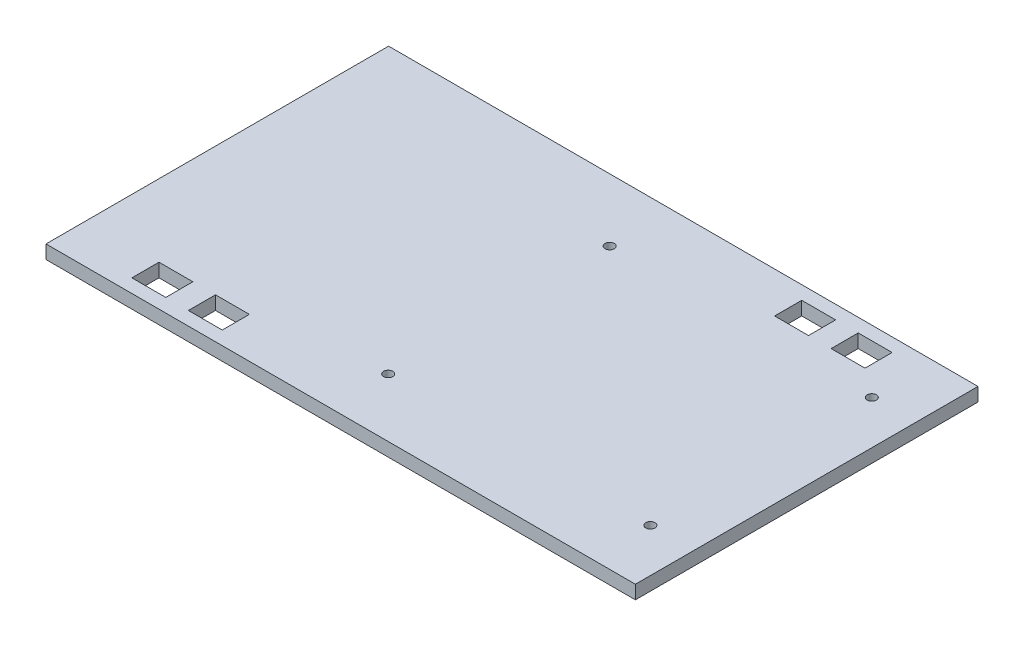
ISO-10303-21;
HEADER;
FILE_DESCRIPTION(('STEP AP214'),'2;1');
FILE_NAME('part.step','',(''),(''),'','','');
FILE_SCHEMA(('AUTOMOTIVE_DESIGN { 1 0 10303 214 1 1 1 1 }'));
ENDSEC;
DATA;
#1=APPLICATION_CONTEXT('core data for automotive mechanical design processes');
#2=APPLICATION_PROTOCOL_DEFINITION('international standard','automotive_design',2000,#1);
#3=PRODUCT_CONTEXT('',#1,'mechanical');
#4=PRODUCT('Part','Part','',(#3));
#5=PRODUCT_RELATED_PRODUCT_CATEGORY('part','',(#4));
#6=PRODUCT_DEFINITION_FORMATION('','',#4);
#7=PRODUCT_DEFINITION_CONTEXT('part definition',#1,'design');
#8=PRODUCT_DEFINITION('design','',#6,#7);
#9=PRODUCT_DEFINITION_SHAPE('','',#8);
#10=(LENGTH_UNIT() NAMED_UNIT(*) SI_UNIT(.MILLI.,.METRE.));
#11=(NAMED_UNIT(*) PLANE_ANGLE_UNIT() SI_UNIT($,.RADIAN.));
#12=(NAMED_UNIT(*) SI_UNIT($,.STERADIAN.) SOLID_ANGLE_UNIT());
#13=UNCERTAINTY_MEASURE_WITH_UNIT(LENGTH_MEASURE(1.E-05),#10,'distance_accuracy_value','');
#14=(GEOMETRIC_REPRESENTATION_CONTEXT(3) GLOBAL_UNCERTAINTY_ASSIGNED_CONTEXT((#13)) GLOBAL_UNIT_ASSIGNED_CONTEXT((#10,
#11,#12)) REPRESENTATION_CONTEXT('',''));
#15=CARTESIAN_POINT('',(0.,0.,0.));
#16=DIRECTION('',(0.,0.,1.));
#17=DIRECTION('',(1.,0.,0.));
#18=AXIS2_PLACEMENT_3D('',#15,#16,#17);
#19=CARTESIAN_POINT('',(0.,3.,75.8));
#20=DIRECTION('',(0.,0.,-1.));
#21=DIRECTION('',(-1.,0.,0.));
#22=AXIS2_PLACEMENT_3D('',#19,#20,#21);
#23=PLANE('',#22);
#24=DIRECTION('',(1.,0.,0.));
#25=VECTOR('',#24,1.);
#26=CARTESIAN_POINT('',(0.,0.,75.8));
#27=LINE('',#26,#25);
#28=CARTESIAN_POINT('',(0.,0.,75.8));
#29=VERTEX_POINT('',#28);
#30=CARTESIAN_POINT('',(130.41,0.,75.8));
#31=VERTEX_POINT('',#30);
#32=EDGE_CURVE('E312',#29,#31,#27,.T.);
#33=ORIENTED_EDGE('',*,*,#32,.T.);
#34=DIRECTION('',(0.,-1.,0.));
#35=VECTOR('',#34,1.);
#36=CARTESIAN_POINT('',(130.41,3.,75.8));
#37=LINE('',#36,#35);
#38=CARTESIAN_POINT('',(130.41,3.,75.8));
#39=VERTEX_POINT('',#38);
#40=EDGE_CURVE('E11',#39,#31,#37,.T.);
#41=ORIENTED_EDGE('',*,*,#40,.F.);
#42=DIRECTION('',(1.,0.,0.));
#43=VECTOR('',#42,1.);
#44=CARTESIAN_POINT('',(0.,3.,75.8));
#45=LINE('',#44,#43);
#46=CARTESIAN_POINT('',(0.,3.,75.8));
#47=VERTEX_POINT('',#46);
#48=EDGE_CURVE('E364',#47,#39,#45,.T.);
#49=ORIENTED_EDGE('',*,*,#48,.F.);
#50=DIRECTION('',(0.,-1.,0.));
#51=VECTOR('',#50,1.);
#52=CARTESIAN_POINT('',(0.,3.,75.8));
#53=LINE('',#52,#51);
#54=EDGE_CURVE('E379',#47,#29,#53,.T.);
#55=ORIENTED_EDGE('',*,*,#54,.T.);
#56=EDGE_LOOP('',(#33,#41,#49,#55));
#57=FACE_BOUND('',#56,.T.);
#58=ADVANCED_FACE('F41',(#57),#23,.F.);
#59=CARTESIAN_POINT('',(130.41,3.,0.));
#60=DIRECTION('',(1.,0.,0.));
#61=DIRECTION('',(0.,0.,-1.));
#62=AXIS2_PLACEMENT_3D('',#59,#60,#61);
#63=PLANE('',#62);
#64=DIRECTION('',(0.,0.,1.));
#65=VECTOR('',#64,1.);
#66=CARTESIAN_POINT('',(130.41,0.,0.));
#67=LINE('',#66,#65);
#68=CARTESIAN_POINT('',(130.41,0.,0.));
#69=VERTEX_POINT('',#68);
#70=EDGE_CURVE('E383',#69,#31,#67,.T.);
#71=ORIENTED_EDGE('',*,*,#70,.F.);
#72=DIRECTION('',(0.,-1.,0.));
#73=VECTOR('',#72,1.);
#74=CARTESIAN_POINT('',(130.41,3.,0.));
#75=LINE('',#74,#73);
#76=CARTESIAN_POINT('',(130.41,3.,0.));
#77=VERTEX_POINT('',#76);
#78=EDGE_CURVE('E49',#77,#69,#75,.T.);
#79=ORIENTED_EDGE('',*,*,#78,.F.);
#80=DIRECTION('',(0.,0.,1.));
#81=VECTOR('',#80,1.);
#82=CARTESIAN_POINT('',(130.41,3.,0.));
#83=LINE('',#82,#81);
#84=EDGE_CURVE('E367',#77,#39,#83,.T.);
#85=ORIENTED_EDGE('',*,*,#84,.T.);
#86=ORIENTED_EDGE('',*,*,#40,.T.);
#87=EDGE_LOOP('',(#71,#79,#85,#86));
#88=FACE_BOUND('',#87,.T.);
#89=ADVANCED_FACE('F406',(#88),#63,.T.);
#90=CARTESIAN_POINT('',(0.,3.,0.));
#91=DIRECTION('',(0.,0.,-1.));
#92=DIRECTION('',(-1.,0.,0.));
#93=AXIS2_PLACEMENT_3D('',#90,#91,#92);
#94=PLANE('',#93);
#95=DIRECTION('',(1.,0.,0.));
#96=VECTOR('',#95,1.);
#97=CARTESIAN_POINT('',(0.,0.,0.));
#98=LINE('',#97,#96);
#99=CARTESIAN_POINT('',(0.,0.,0.));
#100=VERTEX_POINT('',#99);
#101=EDGE_CURVE('E387',#100,#69,#98,.T.);
#102=ORIENTED_EDGE('',*,*,#101,.F.);
#103=DIRECTION('',(0.,-1.,0.));
#104=VECTOR('',#103,1.);
#105=CARTESIAN_POINT('',(0.,3.,0.));
#106=LINE('',#105,#104);
#107=CARTESIAN_POINT('',(0.,3.,0.));
#108=VERTEX_POINT('',#107);
#109=EDGE_CURVE('E396',#108,#100,#106,.T.);
#110=ORIENTED_EDGE('',*,*,#109,.F.);
#111=DIRECTION('',(1.,0.,0.));
#112=VECTOR('',#111,1.);
#113=CARTESIAN_POINT('',(0.,3.,0.));
#114=LINE('',#113,#112);
#115=EDGE_CURVE('E372',#108,#77,#114,.T.);
#116=ORIENTED_EDGE('',*,*,#115,.T.);
#117=ORIENTED_EDGE('',*,*,#78,.T.);
#118=EDGE_LOOP('',(#102,#110,#116,#117));
#119=FACE_BOUND('',#118,.T.);
#120=ADVANCED_FACE('F402',(#119),#94,.T.);
#121=CARTESIAN_POINT('',(0.,3.,0.));
#122=DIRECTION('',(1.,0.,0.));
#123=DIRECTION('',(0.,0.,-1.));
#124=AXIS2_PLACEMENT_3D('',#121,#122,#123);
#125=PLANE('',#124);
#126=DIRECTION('',(0.,0.,1.));
#127=VECTOR('',#126,1.);
#128=CARTESIAN_POINT('',(0.,0.,0.));
#129=LINE('',#128,#127);
#130=EDGE_CURVE('E368',#100,#29,#129,.T.);
#131=ORIENTED_EDGE('',*,*,#130,.T.);
#132=ORIENTED_EDGE('',*,*,#54,.F.);
#133=DIRECTION('',(0.,0.,1.));
#134=VECTOR('',#133,1.);
#135=CARTESIAN_POINT('',(0.,3.,0.));
#136=LINE('',#135,#134);
#137=EDGE_CURVE('E376',#108,#47,#136,.T.);
#138=ORIENTED_EDGE('',*,*,#137,.F.);
#139=ORIENTED_EDGE('',*,*,#109,.T.);
#140=EDGE_LOOP('',(#131,#132,#138,#139));
#141=FACE_BOUND('',#140,.T.);
#142=ADVANCED_FACE('F414',(#141),#125,.F.);
#143=CARTESIAN_POINT('',(0.,3.,0.));
#144=DIRECTION('',(0.,-1.,0.));
#145=DIRECTION('',(0.,0.,-1.));
#146=AXIS2_PLACEMENT_3D('',#143,#144,#145);
#147=PLANE('',#146);
#148=CARTESIAN_POINT('',(62.77,3.,13.86));
#149=DIRECTION('',(0.,-1.,0.));
#150=DIRECTION('',(0.,0.,-1.));
#151=AXIS2_PLACEMENT_3D('',#148,#149,#150);
#152=CIRCLE('',#151,1.025);
#153=CARTESIAN_POINT('',(62.77,3.,12.835));
#154=VERTEX_POINT('',#153);
#155=EDGE_CURVE('E655',#154,#154,#152,.T.);
#156=ORIENTED_EDGE('',*,*,#155,.T.);
#157=EDGE_LOOP('',(#156));
#158=FACE_BOUND('',#157,.T.);
#159=CARTESIAN_POINT('',(62.77,3.,62.86));
#160=DIRECTION('',(0.,-1.,0.));
#161=DIRECTION('',(0.,0.,-1.));
#162=AXIS2_PLACEMENT_3D('',#159,#160,#161);
#163=CIRCLE('',#162,1.025);
#164=CARTESIAN_POINT('',(62.77,3.,61.835));
#165=VERTEX_POINT('',#164);
#166=EDGE_CURVE('E660',#165,#165,#163,.T.);
#167=ORIENTED_EDGE('',*,*,#166,.T.);
#168=EDGE_LOOP('',(#167));
#169=FACE_BOUND('',#168,.T.);
#170=CARTESIAN_POINT('',(120.77,3.,13.86));
#171=DIRECTION('',(0.,-1.,0.));
#172=DIRECTION('',(0.,0.,-1.));
#173=AXIS2_PLACEMENT_3D('',#170,#171,#172);
#174=CIRCLE('',#173,1.025);
#175=CARTESIAN_POINT('',(120.77,3.,12.835));
#176=VERTEX_POINT('',#175);
#177=EDGE_CURVE('E254',#176,#176,#174,.T.);
#178=ORIENTED_EDGE('',*,*,#177,.T.);
#179=EDGE_LOOP('',(#178));
#180=FACE_BOUND('',#179,.T.);
#181=CARTESIAN_POINT('',(120.77,3.,62.86));
#182=DIRECTION('',(0.,-1.,0.));
#183=DIRECTION('',(0.,0.,-1.));
#184=AXIS2_PLACEMENT_3D('',#181,#182,#183);
#185=CIRCLE('',#184,1.025);
#186=CARTESIAN_POINT('',(120.77,3.,61.835));
#187=VERTEX_POINT('',#186);
#188=EDGE_CURVE('E678',#187,#187,#185,.T.);
#189=ORIENTED_EDGE('',*,*,#188,.T.);
#190=EDGE_LOOP('',(#189));
#191=FACE_BOUND('',#190,.T.);
#192=DIRECTION('',(-1.,0.,0.));
#193=VECTOR('',#192,1.);
#194=CARTESIAN_POINT('',(94.41,3.,9.));
#195=LINE('',#194,#193);
#196=CARTESIAN_POINT('',(101.91,3.,9.));
#197=VERTEX_POINT('',#196);
#198=CARTESIAN_POINT('',(94.41,3.,9.));
#199=VERTEX_POINT('',#198);
#200=EDGE_CURVE('E190',#197,#199,#195,.T.);
#201=ORIENTED_EDGE('',*,*,#200,.T.);
#202=DIRECTION('',(0.,0.,-1.));
#203=VECTOR('',#202,1.);
#204=CARTESIAN_POINT('',(94.41,3.,9.));
#205=LINE('',#204,#203);
#206=CARTESIAN_POINT('',(94.41,3.,3.));
#207=VERTEX_POINT('',#206);
#208=EDGE_CURVE('E181',#199,#207,#205,.T.);
#209=ORIENTED_EDGE('',*,*,#208,.T.);
#210=DIRECTION('',(1.,0.,0.));
#211=VECTOR('',#210,1.);
#212=CARTESIAN_POINT('',(94.41,3.,3.));
#213=LINE('',#212,#211);
#214=CARTESIAN_POINT('',(101.91,3.,3.));
#215=VERTEX_POINT('',#214);
#216=EDGE_CURVE('E193',#207,#215,#213,.T.);
#217=ORIENTED_EDGE('',*,*,#216,.T.);
#218=DIRECTION('',(0.,0.,1.));
#219=VECTOR('',#218,1.);
#220=CARTESIAN_POINT('',(101.91,3.,9.));
#221=LINE('',#220,#219);
#222=EDGE_CURVE('E56',#215,#197,#221,.T.);
#223=ORIENTED_EDGE('',*,*,#222,.T.);
#224=EDGE_LOOP('',(#201,#209,#217,#223));
#225=FACE_BOUND('',#224,.T.);
#226=DIRECTION('',(-1.,0.,0.));
#227=VECTOR('',#226,1.);
#228=CARTESIAN_POINT('',(106.91,3.,9.));
#229=LINE('',#228,#227);
#230=CARTESIAN_POINT('',(114.41,3.,9.));
#231=VERTEX_POINT('',#230);
#232=CARTESIAN_POINT('',(106.91,3.,9.));
#233=VERTEX_POINT('',#232);
#234=EDGE_CURVE('E245',#231,#233,#229,.T.);
#235=ORIENTED_EDGE('',*,*,#234,.T.);
#236=DIRECTION('',(0.,0.,-1.));
#237=VECTOR('',#236,1.);
#238=CARTESIAN_POINT('',(106.91,3.,9.));
#239=LINE('',#238,#237);
#240=CARTESIAN_POINT('',(106.91,3.,3.));
#241=VERTEX_POINT('',#240);
#242=EDGE_CURVE('E234',#233,#241,#239,.T.);
#243=ORIENTED_EDGE('',*,*,#242,.T.);
#244=DIRECTION('',(1.,0.,0.));
#245=VECTOR('',#244,1.);
#246=CARTESIAN_POINT('',(106.91,3.,3.));
#247=LINE('',#246,#245);
#248=CARTESIAN_POINT('',(114.41,3.,3.));
#249=VERTEX_POINT('',#248);
#250=EDGE_CURVE('E238',#241,#249,#247,.T.);
#251=ORIENTED_EDGE('',*,*,#250,.T.);
#252=DIRECTION('',(0.,0.,1.));
#253=VECTOR('',#252,1.);
#254=CARTESIAN_POINT('',(114.41,3.,9.));
#255=LINE('',#254,#253);
#256=EDGE_CURVE('E64',#249,#231,#255,.T.);
#257=ORIENTED_EDGE('',*,*,#256,.T.);
#258=EDGE_LOOP('',(#235,#243,#251,#257));
#259=FACE_BOUND('',#258,.T.);
#260=DIRECTION('',(-1.,0.,0.));
#261=VECTOR('',#260,1.);
#262=CARTESIAN_POINT('',(28.5,3.,72.8));
#263=LINE('',#262,#261);
#264=CARTESIAN_POINT('',(36.,3.,72.8));
#265=VERTEX_POINT('',#264);
#266=CARTESIAN_POINT('',(28.5,3.,72.8));
#267=VERTEX_POINT('',#266);
#268=EDGE_CURVE('E289',#265,#267,#263,.T.);
#269=ORIENTED_EDGE('',*,*,#268,.T.);
#270=DIRECTION('',(0.,0.,-1.));
#271=VECTOR('',#270,1.);
#272=CARTESIAN_POINT('',(28.5,3.,72.8));
#273=LINE('',#272,#271);
#274=CARTESIAN_POINT('',(28.5,3.,66.8));
#275=VERTEX_POINT('',#274);
#276=EDGE_CURVE('E276',#267,#275,#273,.T.);
#277=ORIENTED_EDGE('',*,*,#276,.T.);
#278=DIRECTION('',(1.,0.,0.));
#279=VECTOR('',#278,1.);
#280=CARTESIAN_POINT('',(28.5,3.,66.8));
#281=LINE('',#280,#279);
#282=CARTESIAN_POINT('',(36.,3.,66.8));
#283=VERTEX_POINT('',#282);
#284=EDGE_CURVE('E280',#275,#283,#281,.T.);
#285=ORIENTED_EDGE('',*,*,#284,.T.);
#286=DIRECTION('',(0.,0.,1.));
#287=VECTOR('',#286,1.);
#288=CARTESIAN_POINT('',(36.,3.,72.8));
#289=LINE('',#288,#287);
#290=EDGE_CURVE('E285',#283,#265,#289,.T.);
#291=ORIENTED_EDGE('',*,*,#290,.T.);
#292=EDGE_LOOP('',(#269,#277,#285,#291));
#293=FACE_BOUND('',#292,.T.);
#294=DIRECTION('',(-1.,0.,0.));
#295=VECTOR('',#294,1.);
#296=CARTESIAN_POINT('',(16.,3.,72.8));
#297=LINE('',#296,#295);
#298=CARTESIAN_POINT('',(23.5,3.,72.8));
#299=VERTEX_POINT('',#298);
#300=CARTESIAN_POINT('',(16.,3.,72.8));
#301=VERTEX_POINT('',#300);
#302=EDGE_CURVE('E335',#299,#301,#297,.T.);
#303=ORIENTED_EDGE('',*,*,#302,.T.);
#304=DIRECTION('',(0.,0.,-1.));
#305=VECTOR('',#304,1.);
#306=CARTESIAN_POINT('',(16.,3.,72.8));
#307=LINE('',#306,#305);
#308=CARTESIAN_POINT('',(16.,3.,66.8));
#309=VERTEX_POINT('',#308);
#310=EDGE_CURVE('E322',#301,#309,#307,.T.);
#311=ORIENTED_EDGE('',*,*,#310,.T.);
#312=DIRECTION('',(1.,0.,0.));
#313=VECTOR('',#312,1.);
#314=CARTESIAN_POINT('',(16.,3.,66.8));
#315=LINE('',#314,#313);
#316=CARTESIAN_POINT('',(23.5,3.,66.8));
#317=VERTEX_POINT('',#316);
#318=EDGE_CURVE('E326',#309,#317,#315,.T.);
#319=ORIENTED_EDGE('',*,*,#318,.T.);
#320=DIRECTION('',(0.,0.,1.));
#321=VECTOR('',#320,1.);
#322=CARTESIAN_POINT('',(23.5,3.,72.8));
#323=LINE('',#322,#321);
#324=EDGE_CURVE('E331',#317,#299,#323,.T.);
#325=ORIENTED_EDGE('',*,*,#324,.T.);
#326=EDGE_LOOP('',(#303,#311,#319,#325));
#327=FACE_BOUND('',#326,.T.);
#328=ORIENTED_EDGE('',*,*,#48,.T.);
#329=ORIENTED_EDGE('',*,*,#84,.F.);
#330=ORIENTED_EDGE('',*,*,#115,.F.);
#331=ORIENTED_EDGE('',*,*,#137,.T.);
#332=EDGE_LOOP('',(#328,#329,#330,#331));
#333=FACE_BOUND('',#332,.T.);
#334=ADVANCED_FACE('F198',(#158,#169,#180,#191,#225,#259,#293,#327,#333),#147,.F.);
#335=CARTESIAN_POINT('',(0.,0.,0.));
#336=DIRECTION('',(0.,-1.,0.));
#337=DIRECTION('',(0.,0.,-1.));
#338=AXIS2_PLACEMENT_3D('',#335,#336,#337);
#339=PLANE('',#338);
#340=CARTESIAN_POINT('',(62.77,0.,13.86));
#341=DIRECTION('',(0.,-1.,0.));
#342=DIRECTION('',(0.,0.,-1.));
#343=AXIS2_PLACEMENT_3D('',#340,#341,#342);
#344=CIRCLE('',#343,1.025);
#345=CARTESIAN_POINT('',(62.77,0.,12.835));
#346=VERTEX_POINT('',#345);
#347=EDGE_CURVE('E658',#346,#346,#344,.T.);
#348=ORIENTED_EDGE('',*,*,#347,.F.);
#349=EDGE_LOOP('',(#348));
#350=FACE_BOUND('',#349,.T.);
#351=CARTESIAN_POINT('',(62.77,0.,62.86));
#352=DIRECTION('',(0.,-1.,0.));
#353=DIRECTION('',(0.,0.,-1.));
#354=AXIS2_PLACEMENT_3D('',#351,#352,#353);
#355=CIRCLE('',#354,1.025);
#356=CARTESIAN_POINT('',(62.77,0.,61.835));
#357=VERTEX_POINT('',#356);
#358=EDGE_CURVE('E666',#357,#357,#355,.T.);
#359=ORIENTED_EDGE('',*,*,#358,.F.);
#360=EDGE_LOOP('',(#359));
#361=FACE_BOUND('',#360,.T.);
#362=CARTESIAN_POINT('',(120.77,0.,13.86));
#363=DIRECTION('',(0.,-1.,0.));
#364=DIRECTION('',(0.,0.,-1.));
#365=AXIS2_PLACEMENT_3D('',#362,#363,#364);
#366=CIRCLE('',#365,1.025);
#367=CARTESIAN_POINT('',(120.77,0.,12.835));
#368=VERTEX_POINT('',#367);
#369=EDGE_CURVE('E675',#368,#368,#366,.T.);
#370=ORIENTED_EDGE('',*,*,#369,.F.);
#371=EDGE_LOOP('',(#370));
#372=FACE_BOUND('',#371,.T.);
#373=CARTESIAN_POINT('',(120.77,0.,62.86));
#374=DIRECTION('',(0.,-1.,0.));
#375=DIRECTION('',(0.,0.,-1.));
#376=AXIS2_PLACEMENT_3D('',#373,#374,#375);
#377=CIRCLE('',#376,1.025);
#378=CARTESIAN_POINT('',(120.77,0.,61.835));
#379=VERTEX_POINT('',#378);
#380=EDGE_CURVE('E209',#379,#379,#377,.T.);
#381=ORIENTED_EDGE('',*,*,#380,.F.);
#382=EDGE_LOOP('',(#381));
#383=FACE_BOUND('',#382,.T.);
#384=DIRECTION('',(0.,0.,-1.));
#385=VECTOR('',#384,1.);
#386=CARTESIAN_POINT('',(94.41,0.,9.));
#387=LINE('',#386,#385);
#388=CARTESIAN_POINT('',(94.41,0.,9.));
#389=VERTEX_POINT('',#388);
#390=CARTESIAN_POINT('',(94.41,0.,3.));
#391=VERTEX_POINT('',#390);
#392=EDGE_CURVE('E184',#389,#391,#387,.T.);
#393=ORIENTED_EDGE('',*,*,#392,.F.);
#394=DIRECTION('',(-1.,0.,0.));
#395=VECTOR('',#394,1.);
#396=CARTESIAN_POINT('',(94.41,0.,9.));
#397=LINE('',#396,#395);
#398=CARTESIAN_POINT('',(101.91,0.,9.));
#399=VERTEX_POINT('',#398);
#400=EDGE_CURVE('E202',#399,#389,#397,.T.);
#401=ORIENTED_EDGE('',*,*,#400,.F.);
#402=DIRECTION('',(0.,0.,1.));
#403=VECTOR('',#402,1.);
#404=CARTESIAN_POINT('',(101.91,0.,9.));
#405=LINE('',#404,#403);
#406=CARTESIAN_POINT('',(101.91,0.,3.));
#407=VERTEX_POINT('',#406);
#408=EDGE_CURVE('E206',#407,#399,#405,.T.);
#409=ORIENTED_EDGE('',*,*,#408,.F.);
#410=DIRECTION('',(1.,0.,0.));
#411=VECTOR('',#410,1.);
#412=CARTESIAN_POINT('',(94.41,0.,3.));
#413=LINE('',#412,#411);
#414=EDGE_CURVE('E218',#391,#407,#413,.T.);
#415=ORIENTED_EDGE('',*,*,#414,.F.);
#416=EDGE_LOOP('',(#393,#401,#409,#415));
#417=FACE_BOUND('',#416,.T.);
#418=DIRECTION('',(0.,0.,-1.));
#419=VECTOR('',#418,1.);
#420=CARTESIAN_POINT('',(106.91,0.,9.));
#421=LINE('',#420,#419);
#422=CARTESIAN_POINT('',(106.91,0.,9.));
#423=VERTEX_POINT('',#422);
#424=CARTESIAN_POINT('',(106.91,0.,3.));
#425=VERTEX_POINT('',#424);
#426=EDGE_CURVE('E250',#423,#425,#421,.T.);
#427=ORIENTED_EDGE('',*,*,#426,.F.);
#428=DIRECTION('',(-1.,0.,0.));
#429=VECTOR('',#428,1.);
#430=CARTESIAN_POINT('',(106.91,0.,9.));
#431=LINE('',#430,#429);
#432=CARTESIAN_POINT('',(114.41,0.,9.));
#433=VERTEX_POINT('',#432);
#434=EDGE_CURVE('E239',#433,#423,#431,.T.);
#435=ORIENTED_EDGE('',*,*,#434,.F.);
#436=DIRECTION('',(0.,0.,1.));
#437=VECTOR('',#436,1.);
#438=CARTESIAN_POINT('',(114.41,0.,9.));
#439=LINE('',#438,#437);
#440=CARTESIAN_POINT('',(114.41,0.,3.));
#441=VERTEX_POINT('',#440);
#442=EDGE_CURVE('E258',#441,#433,#439,.T.);
#443=ORIENTED_EDGE('',*,*,#442,.F.);
#444=DIRECTION('',(1.,0.,0.));
#445=VECTOR('',#444,1.);
#446=CARTESIAN_POINT('',(106.91,0.,3.));
#447=LINE('',#446,#445);
#448=EDGE_CURVE('E253',#425,#441,#447,.T.);
#449=ORIENTED_EDGE('',*,*,#448,.F.);
#450=EDGE_LOOP('',(#427,#435,#443,#449));
#451=FACE_BOUND('',#450,.T.);
#452=DIRECTION('',(0.,0.,-1.));
#453=VECTOR('',#452,1.);
#454=CARTESIAN_POINT('',(28.5,0.,72.8));
#455=LINE('',#454,#453);
#456=CARTESIAN_POINT('',(28.5,0.,72.8));
#457=VERTEX_POINT('',#456);
#458=CARTESIAN_POINT('',(28.5,0.,66.8));
#459=VERTEX_POINT('',#458);
#460=EDGE_CURVE('E294',#457,#459,#455,.T.);
#461=ORIENTED_EDGE('',*,*,#460,.F.);
#462=DIRECTION('',(-1.,0.,0.));
#463=VECTOR('',#462,1.);
#464=CARTESIAN_POINT('',(28.5,0.,72.8));
#465=LINE('',#464,#463);
#466=CARTESIAN_POINT('',(36.,0.,72.8));
#467=VERTEX_POINT('',#466);
#468=EDGE_CURVE('E281',#467,#457,#465,.T.);
#469=ORIENTED_EDGE('',*,*,#468,.F.);
#470=DIRECTION('',(0.,0.,1.));
#471=VECTOR('',#470,1.);
#472=CARTESIAN_POINT('',(36.,0.,72.8));
#473=LINE('',#472,#471);
#474=CARTESIAN_POINT('',(36.,0.,66.8));
#475=VERTEX_POINT('',#474);
#476=EDGE_CURVE('E302',#475,#467,#473,.T.);
#477=ORIENTED_EDGE('',*,*,#476,.F.);
#478=DIRECTION('',(1.,0.,0.));
#479=VECTOR('',#478,1.);
#480=CARTESIAN_POINT('',(28.5,0.,66.8));
#481=LINE('',#480,#479);
#482=EDGE_CURVE('E297',#459,#475,#481,.T.);
#483=ORIENTED_EDGE('',*,*,#482,.F.);
#484=EDGE_LOOP('',(#461,#469,#477,#483));
#485=FACE_BOUND('',#484,.T.);
#486=DIRECTION('',(0.,0.,-1.));
#487=VECTOR('',#486,1.);
#488=CARTESIAN_POINT('',(16.,0.,72.8));
#489=LINE('',#488,#487);
#490=CARTESIAN_POINT('',(16.,0.,72.8));
#491=VERTEX_POINT('',#490);
#492=CARTESIAN_POINT('',(16.,0.,66.8));
#493=VERTEX_POINT('',#492);
#494=EDGE_CURVE('E228',#491,#493,#489,.T.);
#495=ORIENTED_EDGE('',*,*,#494,.F.);
#496=DIRECTION('',(-1.,0.,0.));
#497=VECTOR('',#496,1.);
#498=CARTESIAN_POINT('',(16.,0.,72.8));
#499=LINE('',#498,#497);
#500=CARTESIAN_POINT('',(23.5,0.,72.8));
#501=VERTEX_POINT('',#500);
#502=EDGE_CURVE('E327',#501,#491,#499,.T.);
#503=ORIENTED_EDGE('',*,*,#502,.F.);
#504=DIRECTION('',(0.,0.,1.));
#505=VECTOR('',#504,1.);
#506=CARTESIAN_POINT('',(23.5,0.,72.8));
#507=LINE('',#506,#505);
#508=CARTESIAN_POINT('',(23.5,0.,66.8));
#509=VERTEX_POINT('',#508);
#510=EDGE_CURVE('E346',#509,#501,#507,.T.);
#511=ORIENTED_EDGE('',*,*,#510,.F.);
#512=DIRECTION('',(1.,0.,0.));
#513=VECTOR('',#512,1.);
#514=CARTESIAN_POINT('',(16.,0.,66.8));
#515=LINE('',#514,#513);
#516=EDGE_CURVE('E342',#493,#509,#515,.T.);
#517=ORIENTED_EDGE('',*,*,#516,.F.);
#518=EDGE_LOOP('',(#495,#503,#511,#517));
#519=FACE_BOUND('',#518,.T.);
#520=ORIENTED_EDGE('',*,*,#32,.F.);
#521=ORIENTED_EDGE('',*,*,#130,.F.);
#522=ORIENTED_EDGE('',*,*,#101,.T.);
#523=ORIENTED_EDGE('',*,*,#70,.T.);
#524=EDGE_LOOP('',(#520,#521,#522,#523));
#525=FACE_BOUND('',#524,.T.);
#526=ADVANCED_FACE('F411',(#350,#361,#372,#383,#417,#451,#485,#519,#525),#339,.T.);
#527=CARTESIAN_POINT('',(16.,3.,72.8));
#528=DIRECTION('',(-1.,0.,0.));
#529=DIRECTION('',(0.,0.,1.));
#530=AXIS2_PLACEMENT_3D('',#527,#528,#529);
#531=PLANE('',#530);
#532=ORIENTED_EDGE('',*,*,#494,.T.);
#533=DIRECTION('',(0.,-1.,0.));
#534=VECTOR('',#533,1.);
#535=CARTESIAN_POINT('',(16.,3.,66.8));
#536=LINE('',#535,#534);
#537=EDGE_CURVE('E339',#309,#493,#536,.T.);
#538=ORIENTED_EDGE('',*,*,#537,.F.);
#539=ORIENTED_EDGE('',*,*,#310,.F.);
#540=DIRECTION('',(0.,-1.,0.));
#541=VECTOR('',#540,1.);
#542=CARTESIAN_POINT('',(16.,3.,72.8));
#543=LINE('',#542,#541);
#544=EDGE_CURVE('E298',#301,#491,#543,.T.);
#545=ORIENTED_EDGE('',*,*,#544,.T.);
#546=EDGE_LOOP('',(#532,#538,#539,#545));
#547=FACE_BOUND('',#546,.T.);
#548=ADVANCED_FACE('F426',(#547),#531,.F.);
#549=CARTESIAN_POINT('',(16.,3.,72.8));
#550=DIRECTION('',(0.,0.,1.));
#551=DIRECTION('',(1.,0.,0.));
#552=AXIS2_PLACEMENT_3D('',#549,#550,#551);
#553=PLANE('',#552);
#554=ORIENTED_EDGE('',*,*,#502,.T.);
#555=ORIENTED_EDGE('',*,*,#544,.F.);
#556=ORIENTED_EDGE('',*,*,#302,.F.);
#557=DIRECTION('',(0.,-1.,0.));
#558=VECTOR('',#557,1.);
#559=CARTESIAN_POINT('',(23.5,3.,72.8));
#560=LINE('',#559,#558);
#561=EDGE_CURVE('E355',#299,#501,#560,.T.);
#562=ORIENTED_EDGE('',*,*,#561,.T.);
#563=EDGE_LOOP('',(#554,#555,#556,#562));
#564=FACE_BOUND('',#563,.T.);
#565=ADVANCED_FACE('F457',(#564),#553,.F.);
#566=CARTESIAN_POINT('',(23.5,3.,72.8));
#567=DIRECTION('',(1.,0.,0.));
#568=DIRECTION('',(0.,0.,-1.));
#569=AXIS2_PLACEMENT_3D('',#566,#567,#568);
#570=PLANE('',#569);
#571=ORIENTED_EDGE('',*,*,#510,.T.);
#572=ORIENTED_EDGE('',*,*,#561,.F.);
#573=ORIENTED_EDGE('',*,*,#324,.F.);
#574=DIRECTION('',(0.,-1.,0.));
#575=VECTOR('',#574,1.);
#576=CARTESIAN_POINT('',(23.5,3.,66.8));
#577=LINE('',#576,#575);
#578=EDGE_CURVE('E358',#317,#509,#577,.T.);
#579=ORIENTED_EDGE('',*,*,#578,.T.);
#580=EDGE_LOOP('',(#571,#572,#573,#579));
#581=FACE_BOUND('',#580,.T.);
#582=ADVANCED_FACE('F467',(#581),#570,.F.);
#583=CARTESIAN_POINT('',(16.,3.,66.8));
#584=DIRECTION('',(0.,0.,-1.));
#585=DIRECTION('',(-1.,0.,0.));
#586=AXIS2_PLACEMENT_3D('',#583,#584,#585);
#587=PLANE('',#586);
#588=ORIENTED_EDGE('',*,*,#516,.T.);
#589=ORIENTED_EDGE('',*,*,#578,.F.);
#590=ORIENTED_EDGE('',*,*,#318,.F.);
#591=ORIENTED_EDGE('',*,*,#537,.T.);
#592=EDGE_LOOP('',(#588,#589,#590,#591));
#593=FACE_BOUND('',#592,.T.);
#594=ADVANCED_FACE('F477',(#593),#587,.F.);
#595=CARTESIAN_POINT('',(28.5,3.,72.8));
#596=DIRECTION('',(-1.,0.,0.));
#597=DIRECTION('',(0.,0.,1.));
#598=AXIS2_PLACEMENT_3D('',#595,#596,#597);
#599=PLANE('',#598);
#600=ORIENTED_EDGE('',*,*,#460,.T.);
#601=DIRECTION('',(0.,-1.,0.));
#602=VECTOR('',#601,1.);
#603=CARTESIAN_POINT('',(28.5,3.,66.8));
#604=LINE('',#603,#602);
#605=EDGE_CURVE('E293',#275,#459,#604,.T.);
#606=ORIENTED_EDGE('',*,*,#605,.F.);
#607=ORIENTED_EDGE('',*,*,#276,.F.);
#608=DIRECTION('',(0.,-1.,0.));
#609=VECTOR('',#608,1.);
#610=CARTESIAN_POINT('',(28.5,3.,72.8));
#611=LINE('',#610,#609);
#612=EDGE_CURVE('E309',#267,#457,#611,.T.);
#613=ORIENTED_EDGE('',*,*,#612,.T.);
#614=EDGE_LOOP('',(#600,#606,#607,#613));
#615=FACE_BOUND('',#614,.T.);
#616=ADVANCED_FACE('F487',(#615),#599,.F.);
#617=CARTESIAN_POINT('',(28.5,3.,72.8));
#618=DIRECTION('',(0.,0.,1.));
#619=DIRECTION('',(1.,0.,0.));
#620=AXIS2_PLACEMENT_3D('',#617,#618,#619);
#621=PLANE('',#620);
#622=ORIENTED_EDGE('',*,*,#468,.T.);
#623=ORIENTED_EDGE('',*,*,#612,.F.);
#624=ORIENTED_EDGE('',*,*,#268,.F.);
#625=DIRECTION('',(0.,-1.,0.));
#626=VECTOR('',#625,1.);
#627=CARTESIAN_POINT('',(36.,3.,72.8));
#628=LINE('',#627,#626);
#629=EDGE_CURVE('E313',#265,#467,#628,.T.);
#630=ORIENTED_EDGE('',*,*,#629,.T.);
#631=EDGE_LOOP('',(#622,#623,#624,#630));
#632=FACE_BOUND('',#631,.T.);
#633=ADVANCED_FACE('F497',(#632),#621,.F.);
#634=CARTESIAN_POINT('',(36.,3.,72.8));
#635=DIRECTION('',(1.,0.,0.));
#636=DIRECTION('',(0.,0.,-1.));
#637=AXIS2_PLACEMENT_3D('',#634,#635,#636);
#638=PLANE('',#637);
#639=ORIENTED_EDGE('',*,*,#476,.T.);
#640=ORIENTED_EDGE('',*,*,#629,.F.);
#641=ORIENTED_EDGE('',*,*,#290,.F.);
#642=DIRECTION('',(0.,-1.,0.));
#643=VECTOR('',#642,1.);
#644=CARTESIAN_POINT('',(36.,3.,66.8));
#645=LINE('',#644,#643);
#646=EDGE_CURVE('E316',#283,#475,#645,.T.);
#647=ORIENTED_EDGE('',*,*,#646,.T.);
#648=EDGE_LOOP('',(#639,#640,#641,#647));
#649=FACE_BOUND('',#648,.T.);
#650=ADVANCED_FACE('F507',(#649),#638,.F.);
#651=CARTESIAN_POINT('',(28.5,3.,66.8));
#652=DIRECTION('',(0.,0.,-1.));
#653=DIRECTION('',(-1.,0.,0.));
#654=AXIS2_PLACEMENT_3D('',#651,#652,#653);
#655=PLANE('',#654);
#656=ORIENTED_EDGE('',*,*,#482,.T.);
#657=ORIENTED_EDGE('',*,*,#646,.F.);
#658=ORIENTED_EDGE('',*,*,#284,.F.);
#659=ORIENTED_EDGE('',*,*,#605,.T.);
#660=EDGE_LOOP('',(#656,#657,#658,#659));
#661=FACE_BOUND('',#660,.T.);
#662=ADVANCED_FACE('F517',(#661),#655,.F.);
#663=CARTESIAN_POINT('',(106.91,3.,9.));
#664=DIRECTION('',(-1.,0.,0.));
#665=DIRECTION('',(0.,0.,1.));
#666=AXIS2_PLACEMENT_3D('',#663,#664,#665);
#667=PLANE('',#666);
#668=ORIENTED_EDGE('',*,*,#426,.T.);
#669=DIRECTION('',(0.,-1.,0.));
#670=VECTOR('',#669,1.);
#671=CARTESIAN_POINT('',(106.91,3.,3.));
#672=LINE('',#671,#670);
#673=EDGE_CURVE('E249',#241,#425,#672,.T.);
#674=ORIENTED_EDGE('',*,*,#673,.F.);
#675=ORIENTED_EDGE('',*,*,#242,.F.);
#676=DIRECTION('',(0.,-1.,0.));
#677=VECTOR('',#676,1.);
#678=CARTESIAN_POINT('',(106.91,3.,9.));
#679=LINE('',#678,#677);
#680=EDGE_CURVE('E219',#233,#423,#679,.T.);
#681=ORIENTED_EDGE('',*,*,#680,.T.);
#682=EDGE_LOOP('',(#668,#674,#675,#681));
#683=FACE_BOUND('',#682,.T.);
#684=ADVANCED_FACE('F527',(#683),#667,.F.);
#685=CARTESIAN_POINT('',(106.91,3.,9.));
#686=DIRECTION('',(0.,0.,1.));
#687=DIRECTION('',(1.,0.,0.));
#688=AXIS2_PLACEMENT_3D('',#685,#686,#687);
#689=PLANE('',#688);
#690=ORIENTED_EDGE('',*,*,#434,.T.);
#691=ORIENTED_EDGE('',*,*,#680,.F.);
#692=ORIENTED_EDGE('',*,*,#234,.F.);
#693=DIRECTION('',(0.,-1.,0.));
#694=VECTOR('',#693,1.);
#695=CARTESIAN_POINT('',(114.41,3.,9.));
#696=LINE('',#695,#694);
#697=EDGE_CURVE('E267',#231,#433,#696,.T.);
#698=ORIENTED_EDGE('',*,*,#697,.T.);
#699=EDGE_LOOP('',(#690,#691,#692,#698));
#700=FACE_BOUND('',#699,.T.);
#701=ADVANCED_FACE('F537',(#700),#689,.F.);
#702=CARTESIAN_POINT('',(114.41,3.,9.));
#703=DIRECTION('',(1.,0.,0.));
#704=DIRECTION('',(0.,0.,-1.));
#705=AXIS2_PLACEMENT_3D('',#702,#703,#704);
#706=PLANE('',#705);
#707=ORIENTED_EDGE('',*,*,#442,.T.);
#708=ORIENTED_EDGE('',*,*,#697,.F.);
#709=ORIENTED_EDGE('',*,*,#256,.F.);
#710=DIRECTION('',(0.,-1.,0.));
#711=VECTOR('',#710,1.);
#712=CARTESIAN_POINT('',(114.41,3.,3.));
#713=LINE('',#712,#711);
#714=EDGE_CURVE('E270',#249,#441,#713,.T.);
#715=ORIENTED_EDGE('',*,*,#714,.T.);
#716=EDGE_LOOP('',(#707,#708,#709,#715));
#717=FACE_BOUND('',#716,.T.);
#718=ADVANCED_FACE('F547',(#717),#706,.F.);
#719=CARTESIAN_POINT('',(106.91,3.,3.));
#720=DIRECTION('',(0.,0.,-1.));
#721=DIRECTION('',(-1.,0.,0.));
#722=AXIS2_PLACEMENT_3D('',#719,#720,#721);
#723=PLANE('',#722);
#724=ORIENTED_EDGE('',*,*,#448,.T.);
#725=ORIENTED_EDGE('',*,*,#714,.F.);
#726=ORIENTED_EDGE('',*,*,#250,.F.);
#727=ORIENTED_EDGE('',*,*,#673,.T.);
#728=EDGE_LOOP('',(#724,#725,#726,#727));
#729=FACE_BOUND('',#728,.T.);
#730=ADVANCED_FACE('F557',(#729),#723,.F.);
#731=CARTESIAN_POINT('',(94.41,3.,9.));
#732=DIRECTION('',(-1.,0.,0.));
#733=DIRECTION('',(0.,0.,1.));
#734=AXIS2_PLACEMENT_3D('',#731,#732,#733);
#735=PLANE('',#734);
#736=ORIENTED_EDGE('',*,*,#392,.T.);
#737=DIRECTION('',(0.,-1.,0.));
#738=VECTOR('',#737,1.);
#739=CARTESIAN_POINT('',(94.41,3.,3.));
#740=LINE('',#739,#738);
#741=EDGE_CURVE('E177',#207,#391,#740,.T.);
#742=ORIENTED_EDGE('',*,*,#741,.F.);
#743=ORIENTED_EDGE('',*,*,#208,.F.);
#744=DIRECTION('',(0.,-1.,0.));
#745=VECTOR('',#744,1.);
#746=CARTESIAN_POINT('',(94.41,3.,9.));
#747=LINE('',#746,#745);
#748=EDGE_CURVE('E225',#199,#389,#747,.T.);
#749=ORIENTED_EDGE('',*,*,#748,.T.);
#750=EDGE_LOOP('',(#736,#742,#743,#749));
#751=FACE_BOUND('',#750,.T.);
#752=ADVANCED_FACE('F179',(#751),#735,.F.);
#753=CARTESIAN_POINT('',(94.41,3.,9.));
#754=DIRECTION('',(0.,0.,1.));
#755=DIRECTION('',(1.,0.,0.));
#756=AXIS2_PLACEMENT_3D('',#753,#754,#755);
#757=PLANE('',#756);
#758=ORIENTED_EDGE('',*,*,#400,.T.);
#759=ORIENTED_EDGE('',*,*,#748,.F.);
#760=ORIENTED_EDGE('',*,*,#200,.F.);
#761=DIRECTION('',(0.,-1.,0.));
#762=VECTOR('',#761,1.);
#763=CARTESIAN_POINT('',(101.91,3.,9.));
#764=LINE('',#763,#762);
#765=EDGE_CURVE('E229',#197,#399,#764,.T.);
#766=ORIENTED_EDGE('',*,*,#765,.T.);
#767=EDGE_LOOP('',(#758,#759,#760,#766));
#768=FACE_BOUND('',#767,.T.);
#769=ADVANCED_FACE('F575',(#768),#757,.F.);
#770=CARTESIAN_POINT('',(101.91,3.,9.));
#771=DIRECTION('',(1.,0.,0.));
#772=DIRECTION('',(0.,0.,-1.));
#773=AXIS2_PLACEMENT_3D('',#770,#771,#772);
#774=PLANE('',#773);
#775=ORIENTED_EDGE('',*,*,#408,.T.);
#776=ORIENTED_EDGE('',*,*,#765,.F.);
#777=ORIENTED_EDGE('',*,*,#222,.F.);
#778=DIRECTION('',(0.,-1.,0.));
#779=VECTOR('',#778,1.);
#780=CARTESIAN_POINT('',(101.91,3.,3.));
#781=LINE('',#780,#779);
#782=EDGE_CURVE('E189',#215,#407,#781,.T.);
#783=ORIENTED_EDGE('',*,*,#782,.T.);
#784=EDGE_LOOP('',(#775,#776,#777,#783));
#785=FACE_BOUND('',#784,.T.);
#786=ADVANCED_FACE('F584',(#785),#774,.F.);
#787=CARTESIAN_POINT('',(94.41,3.,3.));
#788=DIRECTION('',(0.,0.,-1.));
#789=DIRECTION('',(-1.,0.,0.));
#790=AXIS2_PLACEMENT_3D('',#787,#788,#789);
#791=PLANE('',#790);
#792=ORIENTED_EDGE('',*,*,#414,.T.);
#793=ORIENTED_EDGE('',*,*,#782,.F.);
#794=ORIENTED_EDGE('',*,*,#216,.F.);
#795=ORIENTED_EDGE('',*,*,#741,.T.);
#796=EDGE_LOOP('',(#792,#793,#794,#795));
#797=FACE_BOUND('',#796,.T.);
#798=ADVANCED_FACE('F194',(#797),#791,.F.);
#799=CARTESIAN_POINT('',(120.77,3.,62.86));
#800=DIRECTION('',(0.,-1.,0.));
#801=DIRECTION('',(0.,0.,-1.));
#802=AXIS2_PLACEMENT_3D('',#799,#800,#801);
#803=CYLINDRICAL_SURFACE('',#802,1.025);
#804=ORIENTED_EDGE('',*,*,#188,.F.);
#805=EDGE_LOOP('',(#804));
#806=FACE_BOUND('',#805,.T.);
#807=ORIENTED_EDGE('',*,*,#380,.T.);
#808=EDGE_LOOP('',(#807));
#809=FACE_BOUND('',#808,.T.);
#810=ADVANCED_FACE('F602',(#806,#809),#803,.F.);
#811=CARTESIAN_POINT('',(120.77,3.,13.86));
#812=DIRECTION('',(0.,-1.,0.));
#813=DIRECTION('',(0.,0.,-1.));
#814=AXIS2_PLACEMENT_3D('',#811,#812,#813);
#815=CYLINDRICAL_SURFACE('',#814,1.025);
#816=ORIENTED_EDGE('',*,*,#177,.F.);
#817=EDGE_LOOP('',(#816));
#818=FACE_BOUND('',#817,.T.);
#819=ORIENTED_EDGE('',*,*,#369,.T.);
#820=EDGE_LOOP('',(#819));
#821=FACE_BOUND('',#820,.T.);
#822=ADVANCED_FACE('F611',(#818,#821),#815,.F.);
#823=CARTESIAN_POINT('',(62.77,3.,62.86));
#824=DIRECTION('',(0.,-1.,0.));
#825=DIRECTION('',(0.,0.,-1.));
#826=AXIS2_PLACEMENT_3D('',#823,#824,#825);
#827=CYLINDRICAL_SURFACE('',#826,1.025);
#828=ORIENTED_EDGE('',*,*,#166,.F.);
#829=EDGE_LOOP('',(#828));
#830=FACE_BOUND('',#829,.T.);
#831=ORIENTED_EDGE('',*,*,#358,.T.);
#832=EDGE_LOOP('',(#831));
#833=FACE_BOUND('',#832,.T.);
#834=ADVANCED_FACE('F620',(#830,#833),#827,.F.);
#835=CARTESIAN_POINT('',(62.77,3.,13.86));
#836=DIRECTION('',(0.,-1.,0.));
#837=DIRECTION('',(0.,0.,-1.));
#838=AXIS2_PLACEMENT_3D('',#835,#836,#837);
#839=CYLINDRICAL_SURFACE('',#838,1.025);
#840=ORIENTED_EDGE('',*,*,#155,.F.);
#841=EDGE_LOOP('',(#840));
#842=FACE_BOUND('',#841,.T.);
#843=ORIENTED_EDGE('',*,*,#347,.T.);
#844=EDGE_LOOP('',(#843));
#845=FACE_BOUND('',#844,.T.);
#846=ADVANCED_FACE('F639',(#842,#845),#839,.F.);
#847=CLOSED_SHELL('',(#58,#89,#120,#142,#334,#526,#548,#565,#582,#594,#616,#633,#650,#662,#684,
#701,#718,#730,#752,#769,#786,#798,#810,#822,#834,#846));
#848=MANIFOLD_SOLID_BREP('B2',#847);
#849=ADVANCED_BREP_SHAPE_REPRESENTATION('',(#18,#848),#14);
#850=SHAPE_DEFINITION_REPRESENTATION(#9,#849);
ENDSEC;
END-ISO-10303-21;
